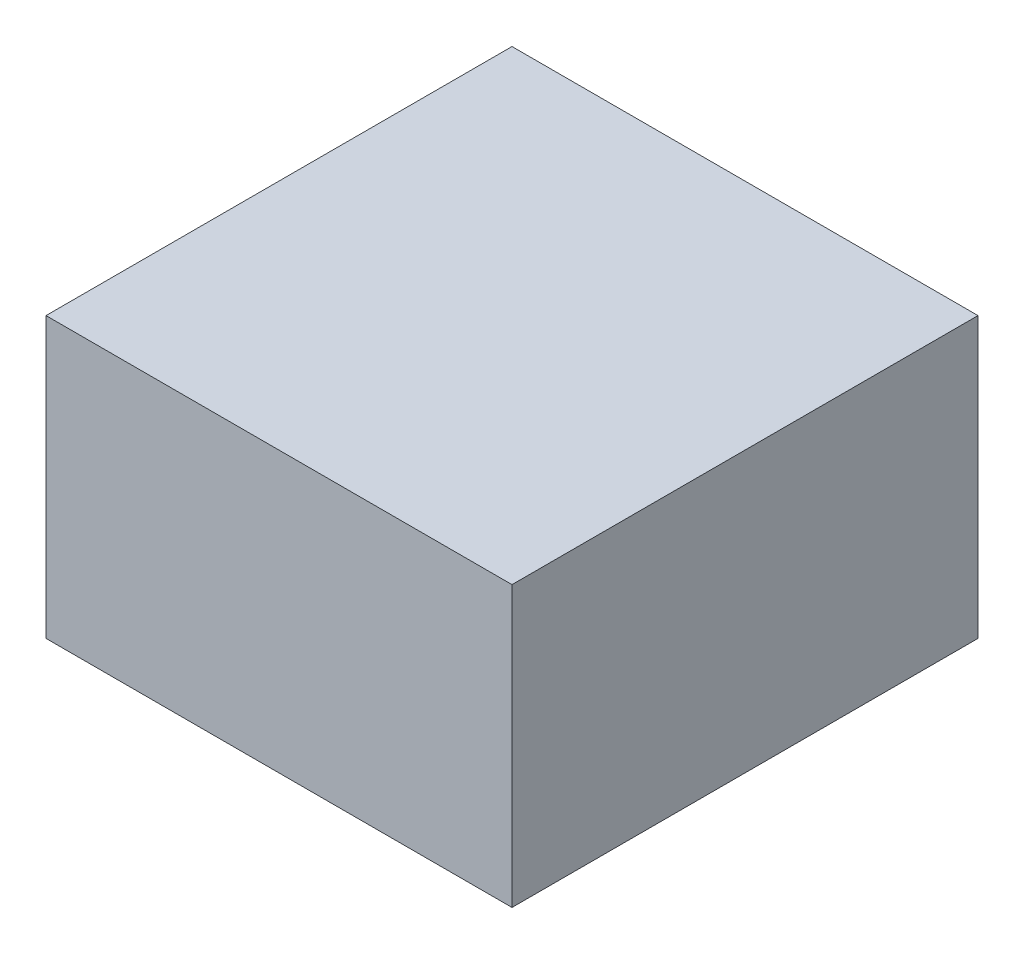
ISO-10303-21;
HEADER;
FILE_DESCRIPTION(('STEP AP214'),'2;1');
FILE_NAME('part.step','',(''),(''),'','','');
FILE_SCHEMA(('AUTOMOTIVE_DESIGN { 1 0 10303 214 1 1 1 1 }'));
ENDSEC;
DATA;
#1=APPLICATION_CONTEXT('core data for automotive mechanical design processes');
#2=APPLICATION_PROTOCOL_DEFINITION('international standard','automotive_design',2000,#1);
#3=PRODUCT_CONTEXT('',#1,'mechanical');
#4=PRODUCT('Part','Part','',(#3));
#5=PRODUCT_RELATED_PRODUCT_CATEGORY('part','',(#4));
#6=PRODUCT_DEFINITION_FORMATION('','',#4);
#7=PRODUCT_DEFINITION_CONTEXT('part definition',#1,'design');
#8=PRODUCT_DEFINITION('design','',#6,#7);
#9=PRODUCT_DEFINITION_SHAPE('','',#8);
#10=(LENGTH_UNIT() NAMED_UNIT(*) SI_UNIT(.MILLI.,.METRE.));
#11=(NAMED_UNIT(*) PLANE_ANGLE_UNIT() SI_UNIT($,.RADIAN.));
#12=(NAMED_UNIT(*) SI_UNIT($,.STERADIAN.) SOLID_ANGLE_UNIT());
#13=UNCERTAINTY_MEASURE_WITH_UNIT(LENGTH_MEASURE(1.E-05),#10,'distance_accuracy_value','');
#14=(GEOMETRIC_REPRESENTATION_CONTEXT(3) GLOBAL_UNCERTAINTY_ASSIGNED_CONTEXT((#13)) GLOBAL_UNIT_ASSIGNED_CONTEXT((#10,
#11,#12)) REPRESENTATION_CONTEXT('',''));
#15=CARTESIAN_POINT('',(0.,0.,0.));
#16=DIRECTION('',(0.,0.,1.));
#17=DIRECTION('',(1.,0.,0.));
#18=AXIS2_PLACEMENT_3D('',#15,#16,#17);
#19=CARTESIAN_POINT('',(-6.35,7.62,-6.35));
#20=DIRECTION('',(1.,0.,0.));
#21=DIRECTION('',(0.,0.,-1.));
#22=AXIS2_PLACEMENT_3D('',#19,#20,#21);
#23=PLANE('',#22);
#24=DIRECTION('',(0.,0.,1.));
#25=VECTOR('',#24,1.);
#26=CARTESIAN_POINT('',(-6.35,0.,-6.35));
#27=LINE('',#26,#25);
#28=CARTESIAN_POINT('',(-6.35,0.,-6.35));
#29=VERTEX_POINT('',#28);
#30=CARTESIAN_POINT('',(-6.35,0.,6.35));
#31=VERTEX_POINT('',#30);
#32=EDGE_CURVE('E109',#29,#31,#27,.T.);
#33=ORIENTED_EDGE('',*,*,#32,.T.);
#34=DIRECTION('',(0.,-1.,0.));
#35=VECTOR('',#34,1.);
#36=CARTESIAN_POINT('',(-6.35,7.62,6.35));
#37=LINE('',#36,#35);
#38=CARTESIAN_POINT('',(-6.35,7.62,6.35));
#39=VERTEX_POINT('',#38);
#40=EDGE_CURVE('E11',#39,#31,#37,.T.);
#41=ORIENTED_EDGE('',*,*,#40,.F.);
#42=DIRECTION('',(0.,0.,1.));
#43=VECTOR('',#42,1.);
#44=CARTESIAN_POINT('',(-6.35,7.62,-6.35));
#45=LINE('',#44,#43);
#46=CARTESIAN_POINT('',(-6.35,7.62,-6.35));
#47=VERTEX_POINT('',#46);
#48=EDGE_CURVE('E93',#47,#39,#45,.T.);
#49=ORIENTED_EDGE('',*,*,#48,.F.);
#50=DIRECTION('',(0.,-1.,0.));
#51=VECTOR('',#50,1.);
#52=CARTESIAN_POINT('',(-6.35,7.62,-6.35));
#53=LINE('',#52,#51);
#54=EDGE_CURVE('E105',#47,#29,#53,.T.);
#55=ORIENTED_EDGE('',*,*,#54,.T.);
#56=EDGE_LOOP('',(#33,#41,#49,#55));
#57=FACE_BOUND('',#56,.T.);
#58=ADVANCED_FACE('F41',(#57),#23,.F.);
#59=CARTESIAN_POINT('',(6.35,7.62,6.34999999999999));
#60=DIRECTION('',(0.,0.,-1.));
#61=DIRECTION('',(-1.,0.,0.));
#62=AXIS2_PLACEMENT_3D('',#59,#60,#61);
#63=PLANE('',#62);
#64=DIRECTION('',(1.,0.,0.));
#65=VECTOR('',#64,1.);
#66=CARTESIAN_POINT('',(6.35,0.,6.34999999999999));
#67=LINE('',#66,#65);
#68=CARTESIAN_POINT('',(6.35,0.,6.34999999999999));
#69=VERTEX_POINT('',#68);
#70=EDGE_CURVE('E98',#31,#69,#67,.T.);
#71=ORIENTED_EDGE('',*,*,#70,.T.);
#72=DIRECTION('',(0.,-1.,0.));
#73=VECTOR('',#72,1.);
#74=CARTESIAN_POINT('',(6.35,7.62,6.34999999999999));
#75=LINE('',#74,#73);
#76=CARTESIAN_POINT('',(6.35,7.62,6.34999999999999));
#77=VERTEX_POINT('',#76);
#78=EDGE_CURVE('E50',#77,#69,#75,.T.);
#79=ORIENTED_EDGE('',*,*,#78,.F.);
#80=DIRECTION('',(1.,0.,0.));
#81=VECTOR('',#80,1.);
#82=CARTESIAN_POINT('',(6.35,7.62,6.34999999999999));
#83=LINE('',#82,#81);
#84=EDGE_CURVE('E88',#39,#77,#83,.T.);
#85=ORIENTED_EDGE('',*,*,#84,.F.);
#86=ORIENTED_EDGE('',*,*,#40,.T.);
#87=EDGE_LOOP('',(#71,#79,#85,#86));
#88=FACE_BOUND('',#87,.T.);
#89=ADVANCED_FACE('F97',(#88),#63,.F.);
#90=CARTESIAN_POINT('',(6.35,7.62,-6.35));
#91=DIRECTION('',(-1.,0.,0.));
#92=DIRECTION('',(0.,0.,1.));
#93=AXIS2_PLACEMENT_3D('',#90,#91,#92);
#94=PLANE('',#93);
#95=DIRECTION('',(0.,0.,-1.));
#96=VECTOR('',#95,1.);
#97=CARTESIAN_POINT('',(6.35,0.,-6.35));
#98=LINE('',#97,#96);
#99=CARTESIAN_POINT('',(6.35,0.,-6.35));
#100=VERTEX_POINT('',#99);
#101=EDGE_CURVE('E75',#69,#100,#98,.T.);
#102=ORIENTED_EDGE('',*,*,#101,.T.);
#103=DIRECTION('',(0.,-1.,0.));
#104=VECTOR('',#103,1.);
#105=CARTESIAN_POINT('',(6.35,7.62,-6.35));
#106=LINE('',#105,#104);
#107=CARTESIAN_POINT('',(6.35,7.62,-6.35));
#108=VERTEX_POINT('',#107);
#109=EDGE_CURVE('E100',#108,#100,#106,.T.);
#110=ORIENTED_EDGE('',*,*,#109,.F.);
#111=DIRECTION('',(0.,0.,-1.));
#112=VECTOR('',#111,1.);
#113=CARTESIAN_POINT('',(6.35,7.62,-6.35));
#114=LINE('',#113,#112);
#115=EDGE_CURVE('E91',#77,#108,#114,.T.);
#116=ORIENTED_EDGE('',*,*,#115,.F.);
#117=ORIENTED_EDGE('',*,*,#78,.T.);
#118=EDGE_LOOP('',(#102,#110,#116,#117));
#119=FACE_BOUND('',#118,.T.);
#120=ADVANCED_FACE('F101',(#119),#94,.F.);
#121=CARTESIAN_POINT('',(6.35,7.62,-6.35));
#122=DIRECTION('',(0.,0.,1.));
#123=DIRECTION('',(1.,0.,0.));
#124=AXIS2_PLACEMENT_3D('',#121,#122,#123);
#125=PLANE('',#124);
#126=DIRECTION('',(-1.,0.,0.));
#127=VECTOR('',#126,1.);
#128=CARTESIAN_POINT('',(6.35,0.,-6.35));
#129=LINE('',#128,#127);
#130=EDGE_CURVE('E81',#100,#29,#129,.T.);
#131=ORIENTED_EDGE('',*,*,#130,.T.);
#132=ORIENTED_EDGE('',*,*,#54,.F.);
#133=DIRECTION('',(-1.,0.,0.));
#134=VECTOR('',#133,1.);
#135=CARTESIAN_POINT('',(6.35,7.62,-6.35));
#136=LINE('',#135,#134);
#137=EDGE_CURVE('E58',#108,#47,#136,.T.);
#138=ORIENTED_EDGE('',*,*,#137,.F.);
#139=ORIENTED_EDGE('',*,*,#109,.T.);
#140=EDGE_LOOP('',(#131,#132,#138,#139));
#141=FACE_BOUND('',#140,.T.);
#142=ADVANCED_FACE('F122',(#141),#125,.F.);
#143=CARTESIAN_POINT('',(0.,7.62,0.));
#144=DIRECTION('',(0.,-1.,0.));
#145=DIRECTION('',(0.,0.,-1.));
#146=AXIS2_PLACEMENT_3D('',#143,#144,#145);
#147=PLANE('',#146);
#148=ORIENTED_EDGE('',*,*,#48,.T.);
#149=ORIENTED_EDGE('',*,*,#84,.T.);
#150=ORIENTED_EDGE('',*,*,#115,.T.);
#151=ORIENTED_EDGE('',*,*,#137,.T.);
#152=EDGE_LOOP('',(#148,#149,#150,#151));
#153=FACE_BOUND('',#152,.T.);
#154=ADVANCED_FACE('F89',(#153),#147,.F.);
#155=CARTESIAN_POINT('',(0.,0.,0.));
#156=DIRECTION('',(0.,-1.,0.));
#157=DIRECTION('',(0.,0.,-1.));
#158=AXIS2_PLACEMENT_3D('',#155,#156,#157);
#159=PLANE('',#158);
#160=ORIENTED_EDGE('',*,*,#32,.F.);
#161=ORIENTED_EDGE('',*,*,#130,.F.);
#162=ORIENTED_EDGE('',*,*,#101,.F.);
#163=ORIENTED_EDGE('',*,*,#70,.F.);
#164=EDGE_LOOP('',(#160,#161,#162,#163));
#165=FACE_BOUND('',#164,.T.);
#166=ADVANCED_FACE('F125',(#165),#159,.T.);
#167=CLOSED_SHELL('',(#58,#89,#120,#142,#154,#166));
#168=MANIFOLD_SOLID_BREP('B2',#167);
#169=ADVANCED_BREP_SHAPE_REPRESENTATION('',(#18,#168),#14);
#170=SHAPE_DEFINITION_REPRESENTATION(#9,#169);
ENDSEC;
END-ISO-10303-21;
